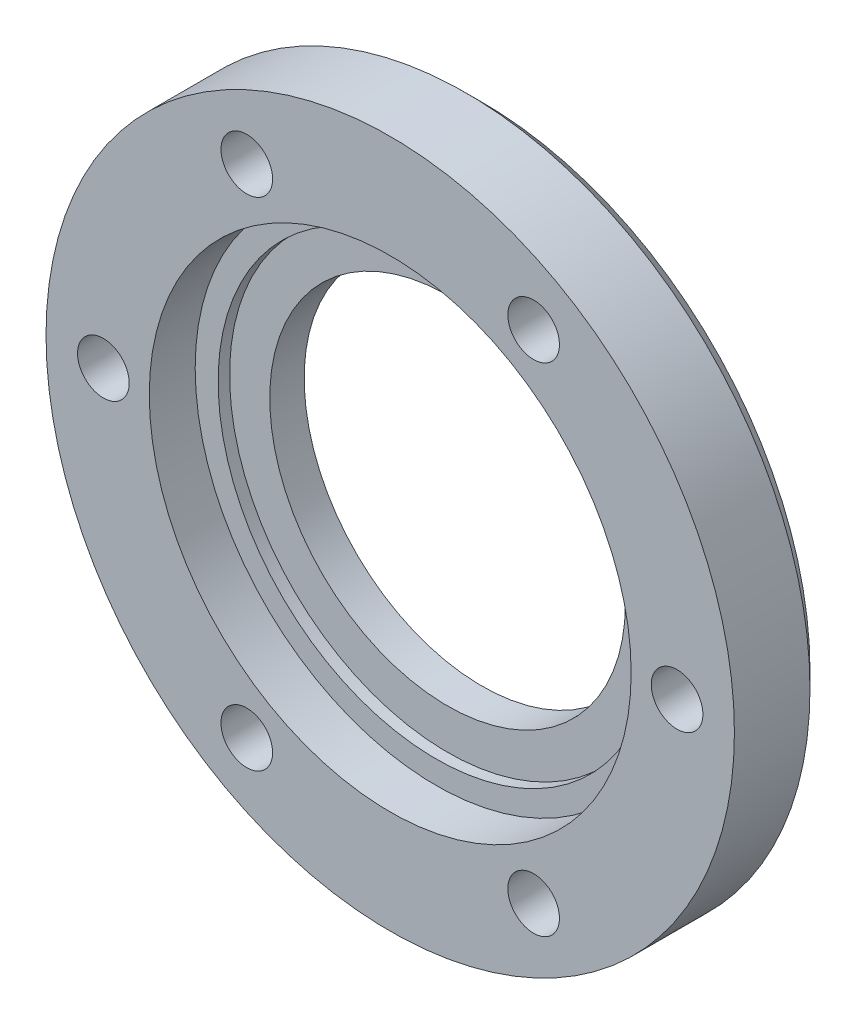
ISO-10303-21;
HEADER;
FILE_DESCRIPTION(('STEP AP214'),'2;1');
FILE_NAME('part.step','',(''),(''),'','','');
FILE_SCHEMA(('AUTOMOTIVE_DESIGN { 1 0 10303 214 1 1 1 1 }'));
ENDSEC;
DATA;
#1=APPLICATION_CONTEXT('core data for automotive mechanical design processes');
#2=APPLICATION_PROTOCOL_DEFINITION('international standard','automotive_design',2000,#1);
#3=PRODUCT_CONTEXT('',#1,'mechanical');
#4=PRODUCT('Part','Part','',(#3));
#5=PRODUCT_RELATED_PRODUCT_CATEGORY('part','',(#4));
#6=PRODUCT_DEFINITION_FORMATION('','',#4);
#7=PRODUCT_DEFINITION_CONTEXT('part definition',#1,'design');
#8=PRODUCT_DEFINITION('design','',#6,#7);
#9=PRODUCT_DEFINITION_SHAPE('','',#8);
#10=(LENGTH_UNIT() NAMED_UNIT(*) SI_UNIT(.MILLI.,.METRE.));
#11=(NAMED_UNIT(*) PLANE_ANGLE_UNIT() SI_UNIT($,.RADIAN.));
#12=(NAMED_UNIT(*) SI_UNIT($,.STERADIAN.) SOLID_ANGLE_UNIT());
#13=UNCERTAINTY_MEASURE_WITH_UNIT(LENGTH_MEASURE(1.E-05),#10,'distance_accuracy_value','');
#14=(GEOMETRIC_REPRESENTATION_CONTEXT(3) GLOBAL_UNCERTAINTY_ASSIGNED_CONTEXT((#13)) GLOBAL_UNIT_ASSIGNED_CONTEXT((#10,
#11,#12)) REPRESENTATION_CONTEXT('',''));
#15=CARTESIAN_POINT('',(0.,0.,0.));
#16=DIRECTION('',(0.,0.,1.));
#17=DIRECTION('',(1.,0.,0.));
#18=AXIS2_PLACEMENT_3D('',#15,#16,#17);
#19=CARTESIAN_POINT('',(-12.5,21.650635094611,8.));
#20=DIRECTION('',(0.,0.,-1.));
#21=DIRECTION('',(-1.,0.,0.));
#22=AXIS2_PLACEMENT_3D('',#19,#20,#21);
#23=CYLINDRICAL_SURFACE('',#22,2.25);
#24=CARTESIAN_POINT('',(-12.5,21.650635094611,8.));
#25=DIRECTION('',(0.,0.,-1.));
#26=DIRECTION('',(-1.,0.,0.));
#27=AXIS2_PLACEMENT_3D('',#24,#25,#26);
#28=CIRCLE('',#27,2.25);
#29=CARTESIAN_POINT('',(-14.75,21.650635094611,8.));
#30=VERTEX_POINT('',#29);
#31=EDGE_CURVE('E93',#30,#30,#28,.T.);
#32=ORIENTED_EDGE('',*,*,#31,.F.);
#33=EDGE_LOOP('',(#32));
#34=FACE_BOUND('',#33,.T.);
#35=CARTESIAN_POINT('',(-12.5,21.650635094611,4.));
#36=DIRECTION('',(0.,0.,-1.));
#37=DIRECTION('',(-1.,0.,0.));
#38=AXIS2_PLACEMENT_3D('',#35,#36,#37);
#39=CIRCLE('',#38,2.25);
#40=CARTESIAN_POINT('',(-14.75,21.650635094611,4.));
#41=VERTEX_POINT('',#40);
#42=EDGE_CURVE('E46',#41,#41,#39,.F.);
#43=ORIENTED_EDGE('',*,*,#42,.F.);
#44=EDGE_LOOP('',(#43));
#45=FACE_BOUND('',#44,.T.);
#46=ADVANCED_FACE('F28',(#34,#45),#23,.F.);
#47=CARTESIAN_POINT('',(-25.,0.,8.));
#48=DIRECTION('',(0.,0.,-1.));
#49=DIRECTION('',(-1.,0.,0.));
#50=AXIS2_PLACEMENT_3D('',#47,#48,#49);
#51=CYLINDRICAL_SURFACE('',#50,2.25);
#52=CARTESIAN_POINT('',(-25.,0.,8.));
#53=DIRECTION('',(0.,0.,-1.));
#54=DIRECTION('',(-1.,0.,0.));
#55=AXIS2_PLACEMENT_3D('',#52,#53,#54);
#56=CIRCLE('',#55,2.25);
#57=CARTESIAN_POINT('',(-27.25,0.,8.));
#58=VERTEX_POINT('',#57);
#59=EDGE_CURVE('E74',#58,#58,#56,.T.);
#60=ORIENTED_EDGE('',*,*,#59,.F.);
#61=EDGE_LOOP('',(#60));
#62=FACE_BOUND('',#61,.T.);
#63=CARTESIAN_POINT('',(-25.,0.,4.));
#64=DIRECTION('',(0.,0.,-1.));
#65=DIRECTION('',(-1.,0.,0.));
#66=AXIS2_PLACEMENT_3D('',#63,#64,#65);
#67=CIRCLE('',#66,2.25);
#68=CARTESIAN_POINT('',(-27.25,0.,4.));
#69=VERTEX_POINT('',#68);
#70=EDGE_CURVE('E51',#69,#69,#67,.F.);
#71=ORIENTED_EDGE('',*,*,#70,.F.);
#72=EDGE_LOOP('',(#71));
#73=FACE_BOUND('',#72,.T.);
#74=ADVANCED_FACE('F196',(#62,#73),#51,.F.);
#75=CARTESIAN_POINT('',(-12.5,-21.650635094611,8.));
#76=DIRECTION('',(0.,0.,-1.));
#77=DIRECTION('',(-1.,0.,0.));
#78=AXIS2_PLACEMENT_3D('',#75,#76,#77);
#79=CYLINDRICAL_SURFACE('',#78,2.25);
#80=CARTESIAN_POINT('',(-12.5,-21.650635094611,8.));
#81=DIRECTION('',(0.,0.,-1.));
#82=DIRECTION('',(-1.,0.,0.));
#83=AXIS2_PLACEMENT_3D('',#80,#81,#82);
#84=CIRCLE('',#83,2.25);
#85=CARTESIAN_POINT('',(-14.75,-21.650635094611,8.));
#86=VERTEX_POINT('',#85);
#87=EDGE_CURVE('E105',#86,#86,#84,.T.);
#88=ORIENTED_EDGE('',*,*,#87,.F.);
#89=EDGE_LOOP('',(#88));
#90=FACE_BOUND('',#89,.T.);
#91=CARTESIAN_POINT('',(-12.5,-21.650635094611,4.));
#92=DIRECTION('',(0.,0.,-1.));
#93=DIRECTION('',(-1.,0.,0.));
#94=AXIS2_PLACEMENT_3D('',#91,#92,#93);
#95=CIRCLE('',#94,2.25);
#96=CARTESIAN_POINT('',(-14.75,-21.650635094611,4.));
#97=VERTEX_POINT('',#96);
#98=EDGE_CURVE('E56',#97,#97,#95,.F.);
#99=ORIENTED_EDGE('',*,*,#98,.F.);
#100=EDGE_LOOP('',(#99));
#101=FACE_BOUND('',#100,.T.);
#102=ADVANCED_FACE('F202',(#90,#101),#79,.F.);
#103=CARTESIAN_POINT('',(12.5,-21.650635094611,8.));
#104=DIRECTION('',(0.,0.,-1.));
#105=DIRECTION('',(-1.,0.,0.));
#106=AXIS2_PLACEMENT_3D('',#103,#104,#105);
#107=CYLINDRICAL_SURFACE('',#106,2.25);
#108=CARTESIAN_POINT('',(12.5,-21.650635094611,8.));
#109=DIRECTION('',(0.,0.,-1.));
#110=DIRECTION('',(-1.,0.,0.));
#111=AXIS2_PLACEMENT_3D('',#108,#109,#110);
#112=CIRCLE('',#111,2.25);
#113=CARTESIAN_POINT('',(10.25,-21.650635094611,8.));
#114=VERTEX_POINT('',#113);
#115=EDGE_CURVE('E102',#114,#114,#112,.T.);
#116=ORIENTED_EDGE('',*,*,#115,.F.);
#117=EDGE_LOOP('',(#116));
#118=FACE_BOUND('',#117,.T.);
#119=CARTESIAN_POINT('',(12.5,-21.650635094611,4.));
#120=DIRECTION('',(0.,0.,-1.));
#121=DIRECTION('',(-1.,0.,0.));
#122=AXIS2_PLACEMENT_3D('',#119,#120,#121);
#123=CIRCLE('',#122,2.25);
#124=CARTESIAN_POINT('',(10.25,-21.650635094611,4.));
#125=VERTEX_POINT('',#124);
#126=EDGE_CURVE('E61',#125,#125,#123,.F.);
#127=ORIENTED_EDGE('',*,*,#126,.F.);
#128=EDGE_LOOP('',(#127));
#129=FACE_BOUND('',#128,.T.);
#130=ADVANCED_FACE('F214',(#118,#129),#107,.F.);
#131=CARTESIAN_POINT('',(25.,0.,8.));
#132=DIRECTION('',(0.,0.,-1.));
#133=DIRECTION('',(-1.,0.,0.));
#134=AXIS2_PLACEMENT_3D('',#131,#132,#133);
#135=CYLINDRICAL_SURFACE('',#134,2.25);
#136=CARTESIAN_POINT('',(25.,0.,8.));
#137=DIRECTION('',(0.,0.,-1.));
#138=DIRECTION('',(-1.,0.,0.));
#139=AXIS2_PLACEMENT_3D('',#136,#137,#138);
#140=CIRCLE('',#139,2.25);
#141=CARTESIAN_POINT('',(22.75,0.,8.));
#142=VERTEX_POINT('',#141);
#143=EDGE_CURVE('E99',#142,#142,#140,.T.);
#144=ORIENTED_EDGE('',*,*,#143,.F.);
#145=EDGE_LOOP('',(#144));
#146=FACE_BOUND('',#145,.T.);
#147=CARTESIAN_POINT('',(25.,0.,4.));
#148=DIRECTION('',(0.,0.,-1.));
#149=DIRECTION('',(-1.,0.,0.));
#150=AXIS2_PLACEMENT_3D('',#147,#148,#149);
#151=CIRCLE('',#150,2.25);
#152=CARTESIAN_POINT('',(22.75,0.,4.));
#153=VERTEX_POINT('',#152);
#154=EDGE_CURVE('E66',#153,#153,#151,.F.);
#155=ORIENTED_EDGE('',*,*,#154,.F.);
#156=EDGE_LOOP('',(#155));
#157=FACE_BOUND('',#156,.T.);
#158=ADVANCED_FACE('F210',(#146,#157),#135,.F.);
#159=CARTESIAN_POINT('',(12.5,21.650635094611,8.));
#160=DIRECTION('',(0.,0.,-1.));
#161=DIRECTION('',(-1.,0.,0.));
#162=AXIS2_PLACEMENT_3D('',#159,#160,#161);
#163=CYLINDRICAL_SURFACE('',#162,2.25);
#164=CARTESIAN_POINT('',(12.5,21.650635094611,8.));
#165=DIRECTION('',(0.,0.,-1.));
#166=DIRECTION('',(-1.,0.,0.));
#167=AXIS2_PLACEMENT_3D('',#164,#165,#166);
#168=CIRCLE('',#167,2.25);
#169=CARTESIAN_POINT('',(10.25,21.650635094611,8.));
#170=VERTEX_POINT('',#169);
#171=EDGE_CURVE('E96',#170,#170,#168,.T.);
#172=ORIENTED_EDGE('',*,*,#171,.F.);
#173=EDGE_LOOP('',(#172));
#174=FACE_BOUND('',#173,.T.);
#175=CARTESIAN_POINT('',(12.5,21.650635094611,4.));
#176=DIRECTION('',(0.,0.,-1.));
#177=DIRECTION('',(-1.,0.,0.));
#178=AXIS2_PLACEMENT_3D('',#175,#176,#177);
#179=CIRCLE('',#178,2.25);
#180=CARTESIAN_POINT('',(10.25,21.650635094611,4.));
#181=VERTEX_POINT('',#180);
#182=EDGE_CURVE('E71',#181,#181,#179,.F.);
#183=ORIENTED_EDGE('',*,*,#182,.F.);
#184=EDGE_LOOP('',(#183));
#185=FACE_BOUND('',#184,.T.);
#186=ADVANCED_FACE('F158',(#174,#185),#163,.F.);
#187=CARTESIAN_POINT('',(0.,0.,8.));
#188=DIRECTION('',(0.,0.,-1.));
#189=DIRECTION('',(-1.,0.,0.));
#190=AXIS2_PLACEMENT_3D('',#187,#188,#189);
#191=CYLINDRICAL_SURFACE('',#190,15.5);
#192=CARTESIAN_POINT('',(0.,0.,0.));
#193=DIRECTION('',(0.,0.,1.));
#194=DIRECTION('',(1.,0.,0.));
#195=AXIS2_PLACEMENT_3D('',#192,#193,#194);
#196=CIRCLE('',#195,15.5);
#197=CARTESIAN_POINT('',(15.5,0.,0.));
#198=VERTEX_POINT('',#197);
#199=EDGE_CURVE('E43',#198,#198,#196,.T.);
#200=ORIENTED_EDGE('',*,*,#199,.F.);
#201=EDGE_LOOP('',(#200));
#202=FACE_BOUND('',#201,.T.);
#203=CARTESIAN_POINT('',(0.,0.,3.));
#204=DIRECTION('',(0.,0.,1.));
#205=DIRECTION('',(1.,0.,0.));
#206=AXIS2_PLACEMENT_3D('',#203,#204,#205);
#207=CIRCLE('',#206,15.5);
#208=CARTESIAN_POINT('',(15.5,0.,3.));
#209=VERTEX_POINT('',#208);
#210=EDGE_CURVE('E76',#209,#209,#207,.T.);
#211=ORIENTED_EDGE('',*,*,#210,.T.);
#212=EDGE_LOOP('',(#211));
#213=FACE_BOUND('',#212,.T.);
#214=ADVANCED_FACE('F155',(#202,#213),#191,.F.);
#215=CARTESIAN_POINT('',(0.,0.,8.));
#216=DIRECTION('',(0.,0.,1.));
#217=DIRECTION('',(1.,0.,0.));
#218=AXIS2_PLACEMENT_3D('',#215,#216,#217);
#219=PLANE('',#218);
#220=ORIENTED_EDGE('',*,*,#59,.T.);
#221=EDGE_LOOP('',(#220));
#222=FACE_BOUND('',#221,.T.);
#223=ORIENTED_EDGE('',*,*,#87,.T.);
#224=EDGE_LOOP('',(#223));
#225=FACE_BOUND('',#224,.T.);
#226=ORIENTED_EDGE('',*,*,#115,.T.);
#227=EDGE_LOOP('',(#226));
#228=FACE_BOUND('',#227,.T.);
#229=ORIENTED_EDGE('',*,*,#143,.T.);
#230=EDGE_LOOP('',(#229));
#231=FACE_BOUND('',#230,.T.);
#232=ORIENTED_EDGE('',*,*,#171,.T.);
#233=EDGE_LOOP('',(#232));
#234=FACE_BOUND('',#233,.T.);
#235=ORIENTED_EDGE('',*,*,#31,.T.);
#236=EDGE_LOOP('',(#235));
#237=FACE_BOUND('',#236,.T.);
#238=CARTESIAN_POINT('',(0.,0.,8.));
#239=DIRECTION('',(0.,0.,1.));
#240=DIRECTION('',(1.,0.,0.));
#241=AXIS2_PLACEMENT_3D('',#238,#239,#240);
#242=CIRCLE('',#241,21.);
#243=CARTESIAN_POINT('',(21.,0.,8.));
#244=VERTEX_POINT('',#243);
#245=EDGE_CURVE('E78',#244,#244,#242,.T.);
#246=ORIENTED_EDGE('',*,*,#245,.F.);
#247=EDGE_LOOP('',(#246));
#248=FACE_BOUND('',#247,.T.);
#249=CARTESIAN_POINT('',(0.,0.,8.));
#250=DIRECTION('',(0.,0.,1.));
#251=DIRECTION('',(1.,0.,0.));
#252=AXIS2_PLACEMENT_3D('',#249,#250,#251);
#253=CIRCLE('',#252,30.);
#254=CARTESIAN_POINT('',(30.,0.,8.));
#255=VERTEX_POINT('',#254);
#256=EDGE_CURVE('E39',#255,#255,#253,.T.);
#257=ORIENTED_EDGE('',*,*,#256,.T.);
#258=EDGE_LOOP('',(#257));
#259=FACE_BOUND('',#258,.T.);
#260=ADVANCED_FACE('F141',(#222,#225,#228,#231,#234,#237,#248,#259),#219,.T.);
#261=CARTESIAN_POINT('',(0.,0.,0.));
#262=DIRECTION('',(0.,0.,1.));
#263=DIRECTION('',(1.,0.,0.));
#264=AXIS2_PLACEMENT_3D('',#261,#262,#263);
#265=PLANE('',#264);
#266=CARTESIAN_POINT('',(0.,0.,0.));
#267=DIRECTION('',(0.,0.,1.));
#268=DIRECTION('',(1.,0.,0.));
#269=AXIS2_PLACEMENT_3D('',#266,#267,#268);
#270=CIRCLE('',#269,28.586);
#271=CARTESIAN_POINT('',(28.586,0.,0.));
#272=VERTEX_POINT('',#271);
#273=EDGE_CURVE('E10',#272,#272,#270,.F.);
#274=ORIENTED_EDGE('',*,*,#273,.T.);
#275=EDGE_LOOP('',(#274));
#276=FACE_BOUND('',#275,.T.);
#277=CARTESIAN_POINT('',(-12.5,21.650635094611,0.));
#278=DIRECTION('',(0.,0.,-1.));
#279=DIRECTION('',(-1.,0.,0.));
#280=AXIS2_PLACEMENT_3D('',#277,#278,#279);
#281=CIRCLE('',#280,3.5);
#282=CARTESIAN_POINT('',(-16.,21.650635094611,0.));
#283=VERTEX_POINT('',#282);
#284=EDGE_CURVE('E132',#283,#283,#281,.T.);
#285=ORIENTED_EDGE('',*,*,#284,.F.);
#286=EDGE_LOOP('',(#285));
#287=FACE_BOUND('',#286,.T.);
#288=CARTESIAN_POINT('',(-25.,0.,0.));
#289=DIRECTION('',(0.,0.,-1.));
#290=DIRECTION('',(-1.,0.,0.));
#291=AXIS2_PLACEMENT_3D('',#288,#289,#290);
#292=CIRCLE('',#291,3.5);
#293=CARTESIAN_POINT('',(-28.5,0.,0.));
#294=VERTEX_POINT('',#293);
#295=EDGE_CURVE('E49',#294,#294,#292,.T.);
#296=ORIENTED_EDGE('',*,*,#295,.F.);
#297=EDGE_LOOP('',(#296));
#298=FACE_BOUND('',#297,.T.);
#299=CARTESIAN_POINT('',(-12.5,-21.650635094611,0.));
#300=DIRECTION('',(0.,0.,-1.));
#301=DIRECTION('',(-1.,0.,0.));
#302=AXIS2_PLACEMENT_3D('',#299,#300,#301);
#303=CIRCLE('',#302,3.5);
#304=CARTESIAN_POINT('',(-16.,-21.650635094611,0.));
#305=VERTEX_POINT('',#304);
#306=EDGE_CURVE('E54',#305,#305,#303,.T.);
#307=ORIENTED_EDGE('',*,*,#306,.F.);
#308=EDGE_LOOP('',(#307));
#309=FACE_BOUND('',#308,.T.);
#310=CARTESIAN_POINT('',(12.5,-21.650635094611,0.));
#311=DIRECTION('',(0.,0.,-1.));
#312=DIRECTION('',(-1.,0.,0.));
#313=AXIS2_PLACEMENT_3D('',#310,#311,#312);
#314=CIRCLE('',#313,3.5);
#315=CARTESIAN_POINT('',(9.,-21.650635094611,0.));
#316=VERTEX_POINT('',#315);
#317=EDGE_CURVE('E59',#316,#316,#314,.T.);
#318=ORIENTED_EDGE('',*,*,#317,.F.);
#319=EDGE_LOOP('',(#318));
#320=FACE_BOUND('',#319,.T.);
#321=CARTESIAN_POINT('',(25.,0.,0.));
#322=DIRECTION('',(0.,0.,-1.));
#323=DIRECTION('',(-1.,0.,0.));
#324=AXIS2_PLACEMENT_3D('',#321,#322,#323);
#325=CIRCLE('',#324,3.5);
#326=CARTESIAN_POINT('',(21.5,0.,0.));
#327=VERTEX_POINT('',#326);
#328=EDGE_CURVE('E64',#327,#327,#325,.T.);
#329=ORIENTED_EDGE('',*,*,#328,.F.);
#330=EDGE_LOOP('',(#329));
#331=FACE_BOUND('',#330,.T.);
#332=CARTESIAN_POINT('',(12.5,21.650635094611,0.));
#333=DIRECTION('',(0.,0.,-1.));
#334=DIRECTION('',(-1.,0.,0.));
#335=AXIS2_PLACEMENT_3D('',#332,#333,#334);
#336=CIRCLE('',#335,3.5);
#337=CARTESIAN_POINT('',(9.,21.650635094611,0.));
#338=VERTEX_POINT('',#337);
#339=EDGE_CURVE('E69',#338,#338,#336,.T.);
#340=ORIENTED_EDGE('',*,*,#339,.F.);
#341=EDGE_LOOP('',(#340));
#342=FACE_BOUND('',#341,.T.);
#343=ORIENTED_EDGE('',*,*,#199,.T.);
#344=EDGE_LOOP('',(#343));
#345=FACE_BOUND('',#344,.T.);
#346=ADVANCED_FACE('F138',(#276,#287,#298,#309,#320,#331,#342,#345),#265,.F.);
#347=CARTESIAN_POINT('',(0.,0.,8.));
#348=DIRECTION('',(0.,0.,-1.));
#349=DIRECTION('',(-1.,0.,0.));
#350=AXIS2_PLACEMENT_3D('',#347,#348,#349);
#351=CYLINDRICAL_SURFACE('',#350,30.);
#352=CARTESIAN_POINT('',(0.,0.,1.414));
#353=DIRECTION('',(0.,0.,1.));
#354=DIRECTION('',(1.,0.,0.));
#355=AXIS2_PLACEMENT_3D('',#352,#353,#354);
#356=CIRCLE('',#355,30.);
#357=CARTESIAN_POINT('',(30.,0.,1.414));
#358=VERTEX_POINT('',#357);
#359=EDGE_CURVE('E35',#358,#358,#356,.T.);
#360=ORIENTED_EDGE('',*,*,#359,.T.);
#361=EDGE_LOOP('',(#360));
#362=FACE_BOUND('',#361,.T.);
#363=ORIENTED_EDGE('',*,*,#256,.F.);
#364=EDGE_LOOP('',(#363));
#365=FACE_BOUND('',#364,.T.);
#366=ADVANCED_FACE('F30',(#362,#365),#351,.T.);
#367=CARTESIAN_POINT('',(0.,0.,4.));
#368=DIRECTION('',(0.,0.,1.));
#369=DIRECTION('',(1.,0.,0.));
#370=AXIS2_PLACEMENT_3D('',#367,#368,#369);
#371=CYLINDRICAL_SURFACE('',#370,21.);
#372=CARTESIAN_POINT('',(0.,0.,4.));
#373=DIRECTION('',(0.,0.,1.));
#374=DIRECTION('',(1.,0.,0.));
#375=AXIS2_PLACEMENT_3D('',#372,#373,#374);
#376=CIRCLE('',#375,21.);
#377=CARTESIAN_POINT('',(21.,0.,4.));
#378=VERTEX_POINT('',#377);
#379=EDGE_CURVE('E83',#378,#378,#376,.T.);
#380=ORIENTED_EDGE('',*,*,#379,.F.);
#381=EDGE_LOOP('',(#380));
#382=FACE_BOUND('',#381,.T.);
#383=ORIENTED_EDGE('',*,*,#245,.T.);
#384=EDGE_LOOP('',(#383));
#385=FACE_BOUND('',#384,.T.);
#386=ADVANCED_FACE('F178',(#382,#385),#371,.F.);
#387=CARTESIAN_POINT('',(0.,0.,4.));
#388=DIRECTION('',(0.,0.,1.));
#389=DIRECTION('',(1.,0.,0.));
#390=AXIS2_PLACEMENT_3D('',#387,#388,#389);
#391=PLANE('',#390);
#392=CARTESIAN_POINT('',(0.,0.,4.));
#393=DIRECTION('',(0.,0.,1.));
#394=DIRECTION('',(1.,0.,0.));
#395=AXIS2_PLACEMENT_3D('',#392,#393,#394);
#396=CIRCLE('',#395,19.);
#397=CARTESIAN_POINT('',(19.,0.,4.));
#398=VERTEX_POINT('',#397);
#399=EDGE_CURVE('E90',#398,#398,#396,.T.);
#400=ORIENTED_EDGE('',*,*,#399,.F.);
#401=EDGE_LOOP('',(#400));
#402=FACE_BOUND('',#401,.T.);
#403=ORIENTED_EDGE('',*,*,#379,.T.);
#404=EDGE_LOOP('',(#403));
#405=FACE_BOUND('',#404,.T.);
#406=ADVANCED_FACE('F172',(#402,#405),#391,.T.);
#407=CARTESIAN_POINT('',(0.,0.,3.));
#408=DIRECTION('',(0.,0.,1.));
#409=DIRECTION('',(1.,0.,0.));
#410=AXIS2_PLACEMENT_3D('',#407,#408,#409);
#411=CYLINDRICAL_SURFACE('',#410,19.);
#412=CARTESIAN_POINT('',(0.,0.,3.));
#413=DIRECTION('',(0.,0.,1.));
#414=DIRECTION('',(1.,0.,0.));
#415=AXIS2_PLACEMENT_3D('',#412,#413,#414);
#416=CIRCLE('',#415,19.);
#417=CARTESIAN_POINT('',(19.,0.,3.));
#418=VERTEX_POINT('',#417);
#419=EDGE_CURVE('E79',#418,#418,#416,.T.);
#420=ORIENTED_EDGE('',*,*,#419,.F.);
#421=EDGE_LOOP('',(#420));
#422=FACE_BOUND('',#421,.T.);
#423=ORIENTED_EDGE('',*,*,#399,.T.);
#424=EDGE_LOOP('',(#423));
#425=FACE_BOUND('',#424,.T.);
#426=ADVANCED_FACE('F166',(#422,#425),#411,.F.);
#427=CARTESIAN_POINT('',(0.,0.,3.));
#428=DIRECTION('',(0.,0.,1.));
#429=DIRECTION('',(1.,0.,0.));
#430=AXIS2_PLACEMENT_3D('',#427,#428,#429);
#431=PLANE('',#430);
#432=ORIENTED_EDGE('',*,*,#210,.F.);
#433=EDGE_LOOP('',(#432));
#434=FACE_BOUND('',#433,.T.);
#435=ORIENTED_EDGE('',*,*,#419,.T.);
#436=EDGE_LOOP('',(#435));
#437=FACE_BOUND('',#436,.T.);
#438=ADVANCED_FACE('F162',(#434,#437),#431,.T.);
#439=CARTESIAN_POINT('',(12.5,21.650635094611,4.));
#440=DIRECTION('',(0.,0.,-1.));
#441=DIRECTION('',(-1.,0.,0.));
#442=AXIS2_PLACEMENT_3D('',#439,#440,#441);
#443=PLANE('',#442);
#444=CARTESIAN_POINT('',(12.5,21.650635094611,4.));
#445=DIRECTION('',(0.,0.,-1.));
#446=DIRECTION('',(-1.,0.,0.));
#447=AXIS2_PLACEMENT_3D('',#444,#445,#446);
#448=CIRCLE('',#447,3.5);
#449=CARTESIAN_POINT('',(9.,21.650635094611,4.));
#450=VERTEX_POINT('',#449);
#451=EDGE_CURVE('E75',#450,#450,#448,.T.);
#452=ORIENTED_EDGE('',*,*,#451,.T.);
#453=EDGE_LOOP('',(#452));
#454=FACE_BOUND('',#453,.T.);
#455=ORIENTED_EDGE('',*,*,#182,.T.);
#456=EDGE_LOOP('',(#455));
#457=FACE_BOUND('',#456,.T.);
#458=ADVANCED_FACE('F165',(#454,#457),#443,.T.);
#459=CARTESIAN_POINT('',(12.5,21.650635094611,4.));
#460=DIRECTION('',(0.,0.,-1.));
#461=DIRECTION('',(-1.,0.,0.));
#462=AXIS2_PLACEMENT_3D('',#459,#460,#461);
#463=CYLINDRICAL_SURFACE('',#462,3.5);
#464=ORIENTED_EDGE('',*,*,#451,.F.);
#465=EDGE_LOOP('',(#464));
#466=FACE_BOUND('',#465,.T.);
#467=ORIENTED_EDGE('',*,*,#339,.T.);
#468=EDGE_LOOP('',(#467));
#469=FACE_BOUND('',#468,.T.);
#470=ADVANCED_FACE('F222',(#466,#469),#463,.F.);
#471=CARTESIAN_POINT('',(25.,0.,4.));
#472=DIRECTION('',(0.,0.,-1.));
#473=DIRECTION('',(-1.,0.,0.));
#474=AXIS2_PLACEMENT_3D('',#471,#472,#473);
#475=PLANE('',#474);
#476=CARTESIAN_POINT('',(25.,0.,4.));
#477=DIRECTION('',(0.,0.,-1.));
#478=DIRECTION('',(-1.,0.,0.));
#479=AXIS2_PLACEMENT_3D('',#476,#477,#478);
#480=CIRCLE('',#479,3.5);
#481=CARTESIAN_POINT('',(21.5,0.,4.));
#482=VERTEX_POINT('',#481);
#483=EDGE_CURVE('E70',#482,#482,#480,.T.);
#484=ORIENTED_EDGE('',*,*,#483,.T.);
#485=EDGE_LOOP('',(#484));
#486=FACE_BOUND('',#485,.T.);
#487=ORIENTED_EDGE('',*,*,#154,.T.);
#488=EDGE_LOOP('',(#487));
#489=FACE_BOUND('',#488,.T.);
#490=ADVANCED_FACE('F225',(#486,#489),#475,.T.);
#491=CARTESIAN_POINT('',(25.,0.,4.));
#492=DIRECTION('',(0.,0.,-1.));
#493=DIRECTION('',(-1.,0.,0.));
#494=AXIS2_PLACEMENT_3D('',#491,#492,#493);
#495=CYLINDRICAL_SURFACE('',#494,3.5);
#496=ORIENTED_EDGE('',*,*,#483,.F.);
#497=EDGE_LOOP('',(#496));
#498=FACE_BOUND('',#497,.T.);
#499=ORIENTED_EDGE('',*,*,#328,.T.);
#500=EDGE_LOOP('',(#499));
#501=FACE_BOUND('',#500,.T.);
#502=ADVANCED_FACE('F230',(#498,#501),#495,.F.);
#503=CARTESIAN_POINT('',(12.5,-21.650635094611,4.));
#504=DIRECTION('',(0.,0.,-1.));
#505=DIRECTION('',(-1.,0.,0.));
#506=AXIS2_PLACEMENT_3D('',#503,#504,#505);
#507=PLANE('',#506);
#508=CARTESIAN_POINT('',(12.5,-21.650635094611,4.));
#509=DIRECTION('',(0.,0.,-1.));
#510=DIRECTION('',(-1.,0.,0.));
#511=AXIS2_PLACEMENT_3D('',#508,#509,#510);
#512=CIRCLE('',#511,3.5);
#513=CARTESIAN_POINT('',(9.,-21.650635094611,4.));
#514=VERTEX_POINT('',#513);
#515=EDGE_CURVE('E65',#514,#514,#512,.T.);
#516=ORIENTED_EDGE('',*,*,#515,.T.);
#517=EDGE_LOOP('',(#516));
#518=FACE_BOUND('',#517,.T.);
#519=ORIENTED_EDGE('',*,*,#126,.T.);
#520=EDGE_LOOP('',(#519));
#521=FACE_BOUND('',#520,.T.);
#522=ADVANCED_FACE('F233',(#518,#521),#507,.T.);
#523=CARTESIAN_POINT('',(12.5,-21.650635094611,4.));
#524=DIRECTION('',(0.,0.,-1.));
#525=DIRECTION('',(-1.,0.,0.));
#526=AXIS2_PLACEMENT_3D('',#523,#524,#525);
#527=CYLINDRICAL_SURFACE('',#526,3.5);
#528=ORIENTED_EDGE('',*,*,#515,.F.);
#529=EDGE_LOOP('',(#528));
#530=FACE_BOUND('',#529,.T.);
#531=ORIENTED_EDGE('',*,*,#317,.T.);
#532=EDGE_LOOP('',(#531));
#533=FACE_BOUND('',#532,.T.);
#534=ADVANCED_FACE('F238',(#530,#533),#527,.F.);
#535=CARTESIAN_POINT('',(-12.5,-21.650635094611,4.));
#536=DIRECTION('',(0.,0.,-1.));
#537=DIRECTION('',(-1.,0.,0.));
#538=AXIS2_PLACEMENT_3D('',#535,#536,#537);
#539=PLANE('',#538);
#540=CARTESIAN_POINT('',(-12.5,-21.650635094611,4.));
#541=DIRECTION('',(0.,0.,-1.));
#542=DIRECTION('',(-1.,0.,0.));
#543=AXIS2_PLACEMENT_3D('',#540,#541,#542);
#544=CIRCLE('',#543,3.5);
#545=CARTESIAN_POINT('',(-16.,-21.650635094611,4.));
#546=VERTEX_POINT('',#545);
#547=EDGE_CURVE('E60',#546,#546,#544,.T.);
#548=ORIENTED_EDGE('',*,*,#547,.T.);
#549=EDGE_LOOP('',(#548));
#550=FACE_BOUND('',#549,.T.);
#551=ORIENTED_EDGE('',*,*,#98,.T.);
#552=EDGE_LOOP('',(#551));
#553=FACE_BOUND('',#552,.T.);
#554=ADVANCED_FACE('F241',(#550,#553),#539,.T.);
#555=CARTESIAN_POINT('',(-12.5,-21.650635094611,4.));
#556=DIRECTION('',(0.,0.,-1.));
#557=DIRECTION('',(-1.,0.,0.));
#558=AXIS2_PLACEMENT_3D('',#555,#556,#557);
#559=CYLINDRICAL_SURFACE('',#558,3.5);
#560=ORIENTED_EDGE('',*,*,#547,.F.);
#561=EDGE_LOOP('',(#560));
#562=FACE_BOUND('',#561,.T.);
#563=ORIENTED_EDGE('',*,*,#306,.T.);
#564=EDGE_LOOP('',(#563));
#565=FACE_BOUND('',#564,.T.);
#566=ADVANCED_FACE('F246',(#562,#565),#559,.F.);
#567=CARTESIAN_POINT('',(-25.,0.,4.));
#568=DIRECTION('',(0.,0.,-1.));
#569=DIRECTION('',(-1.,0.,0.));
#570=AXIS2_PLACEMENT_3D('',#567,#568,#569);
#571=PLANE('',#570);
#572=CARTESIAN_POINT('',(-25.,0.,4.));
#573=DIRECTION('',(0.,0.,-1.));
#574=DIRECTION('',(-1.,0.,0.));
#575=AXIS2_PLACEMENT_3D('',#572,#573,#574);
#576=CIRCLE('',#575,3.5);
#577=CARTESIAN_POINT('',(-28.5,0.,4.));
#578=VERTEX_POINT('',#577);
#579=EDGE_CURVE('E55',#578,#578,#576,.T.);
#580=ORIENTED_EDGE('',*,*,#579,.T.);
#581=EDGE_LOOP('',(#580));
#582=FACE_BOUND('',#581,.T.);
#583=ORIENTED_EDGE('',*,*,#70,.T.);
#584=EDGE_LOOP('',(#583));
#585=FACE_BOUND('',#584,.T.);
#586=ADVANCED_FACE('F249',(#582,#585),#571,.T.);
#587=CARTESIAN_POINT('',(-25.,0.,4.));
#588=DIRECTION('',(0.,0.,-1.));
#589=DIRECTION('',(-1.,0.,0.));
#590=AXIS2_PLACEMENT_3D('',#587,#588,#589);
#591=CYLINDRICAL_SURFACE('',#590,3.5);
#592=ORIENTED_EDGE('',*,*,#579,.F.);
#593=EDGE_LOOP('',(#592));
#594=FACE_BOUND('',#593,.T.);
#595=ORIENTED_EDGE('',*,*,#295,.T.);
#596=EDGE_LOOP('',(#595));
#597=FACE_BOUND('',#596,.T.);
#598=ADVANCED_FACE('F254',(#594,#597),#591,.F.);
#599=CARTESIAN_POINT('',(-12.5,21.650635094611,4.));
#600=DIRECTION('',(0.,0.,-1.));
#601=DIRECTION('',(-1.,0.,0.));
#602=AXIS2_PLACEMENT_3D('',#599,#600,#601);
#603=PLANE('',#602);
#604=CARTESIAN_POINT('',(-12.5,21.650635094611,4.));
#605=DIRECTION('',(0.,0.,-1.));
#606=DIRECTION('',(-1.,0.,0.));
#607=AXIS2_PLACEMENT_3D('',#604,#605,#606);
#608=CIRCLE('',#607,3.5);
#609=CARTESIAN_POINT('',(-16.,21.650635094611,4.));
#610=VERTEX_POINT('',#609);
#611=EDGE_CURVE('E50',#610,#610,#608,.T.);
#612=ORIENTED_EDGE('',*,*,#611,.T.);
#613=EDGE_LOOP('',(#612));
#614=FACE_BOUND('',#613,.T.);
#615=ORIENTED_EDGE('',*,*,#42,.T.);
#616=EDGE_LOOP('',(#615));
#617=FACE_BOUND('',#616,.T.);
#618=ADVANCED_FACE('F257',(#614,#617),#603,.T.);
#619=CARTESIAN_POINT('',(-12.5,21.650635094611,4.));
#620=DIRECTION('',(0.,0.,-1.));
#621=DIRECTION('',(-1.,0.,0.));
#622=AXIS2_PLACEMENT_3D('',#619,#620,#621);
#623=CYLINDRICAL_SURFACE('',#622,3.5);
#624=ORIENTED_EDGE('',*,*,#611,.F.);
#625=EDGE_LOOP('',(#624));
#626=FACE_BOUND('',#625,.T.);
#627=ORIENTED_EDGE('',*,*,#284,.T.);
#628=EDGE_LOOP('',(#627));
#629=FACE_BOUND('',#628,.T.);
#630=ADVANCED_FACE('F136',(#626,#629),#623,.F.);
#631=CARTESIAN_POINT('',(0.,0.,1.414));
#632=DIRECTION('',(0.,0.,1.));
#633=DIRECTION('',(1.,0.,0.));
#634=AXIS2_PLACEMENT_3D('',#631,#632,#633);
#635=CONICAL_SURFACE('',#634,30.,0.785398163397451);
#636=ORIENTED_EDGE('',*,*,#273,.F.);
#637=EDGE_LOOP('',(#636));
#638=FACE_BOUND('',#637,.T.);
#639=ORIENTED_EDGE('',*,*,#359,.F.);
#640=EDGE_LOOP('',(#639));
#641=FACE_BOUND('',#640,.T.);
#642=ADVANCED_FACE('F264',(#638,#641),#635,.T.);
#643=CLOSED_SHELL('',(#46,#74,#102,#130,#158,#186,#214,#260,#346,#366,#386,#406,#426,#438,#458,
#470,#490,#502,#522,#534,#554,#566,#586,#598,#618,#630,#642));
#644=MANIFOLD_SOLID_BREP('B2',#643);
#645=ADVANCED_BREP_SHAPE_REPRESENTATION('',(#18,#644),#14);
#646=SHAPE_DEFINITION_REPRESENTATION(#9,#645);
ENDSEC;
END-ISO-10303-21;
